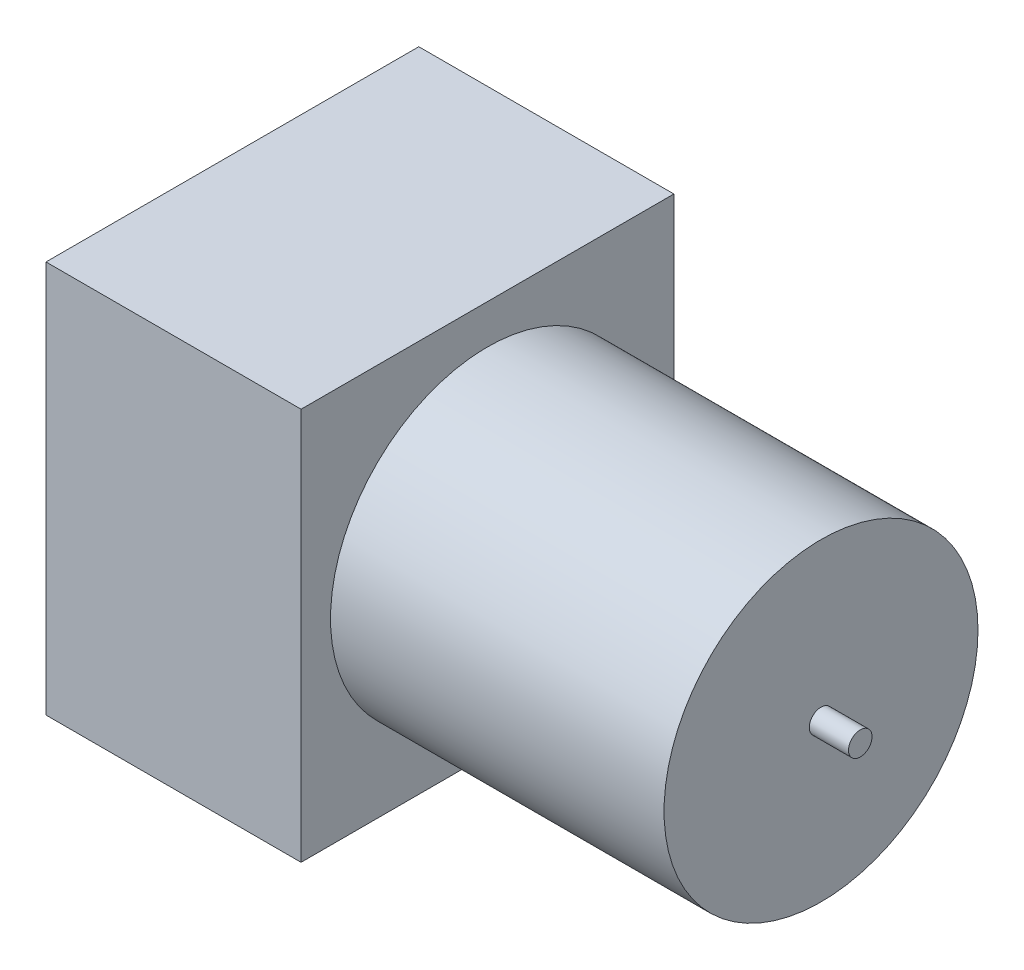
ISO-10303-21;
HEADER;
FILE_DESCRIPTION(('STEP AP214'),'2;1');
FILE_NAME('part.step','',(''),(''),'','','');
FILE_SCHEMA(('AUTOMOTIVE_DESIGN { 1 0 10303 214 1 1 1 1 }'));
ENDSEC;
DATA;
#1=APPLICATION_CONTEXT('core data for automotive mechanical design processes');
#2=APPLICATION_PROTOCOL_DEFINITION('international standard','automotive_design',2000,#1);
#3=PRODUCT_CONTEXT('',#1,'mechanical');
#4=PRODUCT('Part','Part','',(#3));
#5=PRODUCT_RELATED_PRODUCT_CATEGORY('part','',(#4));
#6=PRODUCT_DEFINITION_FORMATION('','',#4);
#7=PRODUCT_DEFINITION_CONTEXT('part definition',#1,'design');
#8=PRODUCT_DEFINITION('design','',#6,#7);
#9=PRODUCT_DEFINITION_SHAPE('','',#8);
#10=(LENGTH_UNIT() NAMED_UNIT(*) SI_UNIT(.MILLI.,.METRE.));
#11=(NAMED_UNIT(*) PLANE_ANGLE_UNIT() SI_UNIT($,.RADIAN.));
#12=(NAMED_UNIT(*) SI_UNIT($,.STERADIAN.) SOLID_ANGLE_UNIT());
#13=UNCERTAINTY_MEASURE_WITH_UNIT(LENGTH_MEASURE(1.E-05),#10,'distance_accuracy_value','');
#14=(GEOMETRIC_REPRESENTATION_CONTEXT(3) GLOBAL_UNCERTAINTY_ASSIGNED_CONTEXT((#13)) GLOBAL_UNIT_ASSIGNED_CONTEXT((#10,
#11,#12)) REPRESENTATION_CONTEXT('',''));
#15=CARTESIAN_POINT('',(0.,0.,0.));
#16=DIRECTION('',(0.,0.,1.));
#17=DIRECTION('',(1.,0.,0.));
#18=AXIS2_PLACEMENT_3D('',#15,#16,#17);
#19=CARTESIAN_POINT('',(65.,100.,47.5));
#20=DIRECTION('',(-1.,0.,0.));
#21=DIRECTION('',(0.,0.,1.));
#22=AXIS2_PLACEMENT_3D('',#19,#20,#21);
#23=PLANE('',#22);
#24=CARTESIAN_POINT('',(65.,50.,0.));
#25=DIRECTION('',(1.,0.,0.));
#26=DIRECTION('',(0.,0.,-1.));
#27=AXIS2_PLACEMENT_3D('',#24,#25,#26);
#28=CIRCLE('',#27,40.);
#29=CARTESIAN_POINT('',(65.,50.,-40.));
#30=VERTEX_POINT('',#29);
#31=EDGE_CURVE('E140',#30,#30,#28,.T.);
#32=ORIENTED_EDGE('',*,*,#31,.F.);
#33=EDGE_LOOP('',(#32));
#34=FACE_BOUND('',#33,.T.);
#35=DIRECTION('',(0.,0.,-1.));
#36=VECTOR('',#35,1.);
#37=CARTESIAN_POINT('',(65.,0.,47.5));
#38=LINE('',#37,#36);
#39=CARTESIAN_POINT('',(65.,0.,47.5));
#40=VERTEX_POINT('',#39);
#41=CARTESIAN_POINT('',(65.,0.,-47.5));
#42=VERTEX_POINT('',#41);
#43=EDGE_CURVE('E125',#40,#42,#38,.T.);
#44=ORIENTED_EDGE('',*,*,#43,.T.);
#45=DIRECTION('',(0.,-1.,0.));
#46=VECTOR('',#45,1.);
#47=CARTESIAN_POINT('',(65.,100.,-47.5));
#48=LINE('',#47,#46);
#49=CARTESIAN_POINT('',(65.,100.,-47.5));
#50=VERTEX_POINT('',#49);
#51=EDGE_CURVE('E112',#50,#42,#48,.T.);
#52=ORIENTED_EDGE('',*,*,#51,.F.);
#53=DIRECTION('',(0.,0.,-1.));
#54=VECTOR('',#53,1.);
#55=CARTESIAN_POINT('',(65.,100.,47.5));
#56=LINE('',#55,#54);
#57=CARTESIAN_POINT('',(65.,100.,47.5));
#58=VERTEX_POINT('',#57);
#59=EDGE_CURVE('E103',#58,#50,#56,.T.);
#60=ORIENTED_EDGE('',*,*,#59,.F.);
#61=DIRECTION('',(0.,-1.,0.));
#62=VECTOR('',#61,1.);
#63=CARTESIAN_POINT('',(65.,100.,47.5));
#64=LINE('',#63,#62);
#65=EDGE_CURVE('E119',#58,#40,#64,.T.);
#66=ORIENTED_EDGE('',*,*,#65,.T.);
#67=EDGE_LOOP('',(#44,#52,#60,#66));
#68=FACE_BOUND('',#67,.T.);
#69=ADVANCED_FACE('F47',(#34,#68),#23,.F.);
#70=CARTESIAN_POINT('',(0.,100.,-47.5));
#71=DIRECTION('',(0.,0.,1.));
#72=DIRECTION('',(1.,0.,0.));
#73=AXIS2_PLACEMENT_3D('',#70,#71,#72);
#74=PLANE('',#73);
#75=DIRECTION('',(-1.,0.,0.));
#76=VECTOR('',#75,1.);
#77=CARTESIAN_POINT('',(0.,0.,-47.5));
#78=LINE('',#77,#76);
#79=CARTESIAN_POINT('',(0.,0.,-47.5));
#80=VERTEX_POINT('',#79);
#81=EDGE_CURVE('E108',#42,#80,#78,.T.);
#82=ORIENTED_EDGE('',*,*,#81,.T.);
#83=DIRECTION('',(0.,-1.,0.));
#84=VECTOR('',#83,1.);
#85=CARTESIAN_POINT('',(0.,100.,-47.5));
#86=LINE('',#85,#84);
#87=CARTESIAN_POINT('',(0.,100.,-47.5));
#88=VERTEX_POINT('',#87);
#89=EDGE_CURVE('E110',#88,#80,#86,.T.);
#90=ORIENTED_EDGE('',*,*,#89,.F.);
#91=DIRECTION('',(-1.,0.,0.));
#92=VECTOR('',#91,1.);
#93=CARTESIAN_POINT('',(0.,100.,-47.5));
#94=LINE('',#93,#92);
#95=EDGE_CURVE('E98',#50,#88,#94,.T.);
#96=ORIENTED_EDGE('',*,*,#95,.F.);
#97=ORIENTED_EDGE('',*,*,#51,.T.);
#98=EDGE_LOOP('',(#82,#90,#96,#97));
#99=FACE_BOUND('',#98,.T.);
#100=ADVANCED_FACE('F107',(#99),#74,.F.);
#101=CARTESIAN_POINT('',(0.,100.,47.5));
#102=DIRECTION('',(1.,0.,0.));
#103=DIRECTION('',(0.,0.,-1.));
#104=AXIS2_PLACEMENT_3D('',#101,#102,#103);
#105=PLANE('',#104);
#106=CARTESIAN_POINT('',(0.,70.,0.));
#107=DIRECTION('',(1.,0.,0.));
#108=DIRECTION('',(0.,0.,-1.));
#109=AXIS2_PLACEMENT_3D('',#106,#107,#108);
#110=CIRCLE('',#109,6.);
#111=CARTESIAN_POINT('',(0.,70.,-6.));
#112=VERTEX_POINT('',#111);
#113=EDGE_CURVE('E55',#112,#112,#110,.F.);
#114=ORIENTED_EDGE('',*,*,#113,.F.);
#115=EDGE_LOOP('',(#114));
#116=FACE_BOUND('',#115,.T.);
#117=CARTESIAN_POINT('',(0.,30.,0.));
#118=DIRECTION('',(1.,0.,0.));
#119=DIRECTION('',(0.,0.,-1.));
#120=AXIS2_PLACEMENT_3D('',#117,#118,#119);
#121=CIRCLE('',#120,6.);
#122=CARTESIAN_POINT('',(0.,30.,-6.));
#123=VERTEX_POINT('',#122);
#124=EDGE_CURVE('E151',#123,#123,#121,.T.);
#125=ORIENTED_EDGE('',*,*,#124,.T.);
#126=EDGE_LOOP('',(#125));
#127=FACE_BOUND('',#126,.T.);
#128=DIRECTION('',(0.,0.,1.));
#129=VECTOR('',#128,1.);
#130=CARTESIAN_POINT('',(0.,0.,47.5));
#131=LINE('',#130,#129);
#132=CARTESIAN_POINT('',(0.,0.,47.5));
#133=VERTEX_POINT('',#132);
#134=EDGE_CURVE('E84',#80,#133,#131,.T.);
#135=ORIENTED_EDGE('',*,*,#134,.T.);
#136=DIRECTION('',(0.,-1.,0.));
#137=VECTOR('',#136,1.);
#138=CARTESIAN_POINT('',(0.,100.,47.5));
#139=LINE('',#138,#137);
#140=CARTESIAN_POINT('',(0.,100.,47.5));
#141=VERTEX_POINT('',#140);
#142=EDGE_CURVE('E115',#141,#133,#139,.T.);
#143=ORIENTED_EDGE('',*,*,#142,.F.);
#144=DIRECTION('',(0.,0.,1.));
#145=VECTOR('',#144,1.);
#146=CARTESIAN_POINT('',(0.,100.,47.5));
#147=LINE('',#146,#145);
#148=EDGE_CURVE('E101',#88,#141,#147,.T.);
#149=ORIENTED_EDGE('',*,*,#148,.F.);
#150=ORIENTED_EDGE('',*,*,#89,.T.);
#151=EDGE_LOOP('',(#135,#143,#149,#150));
#152=FACE_BOUND('',#151,.T.);
#153=ADVANCED_FACE('F111',(#116,#127,#152),#105,.F.);
#154=CARTESIAN_POINT('',(0.,100.,47.5));
#155=DIRECTION('',(0.,0.,-1.));
#156=DIRECTION('',(-1.,0.,0.));
#157=AXIS2_PLACEMENT_3D('',#154,#155,#156);
#158=PLANE('',#157);
#159=DIRECTION('',(1.,0.,0.));
#160=VECTOR('',#159,1.);
#161=CARTESIAN_POINT('',(0.,0.,47.5));
#162=LINE('',#161,#160);
#163=EDGE_CURVE('E89',#133,#40,#162,.T.);
#164=ORIENTED_EDGE('',*,*,#163,.T.);
#165=ORIENTED_EDGE('',*,*,#65,.F.);
#166=DIRECTION('',(1.,0.,0.));
#167=VECTOR('',#166,1.);
#168=CARTESIAN_POINT('',(0.,100.,47.5));
#169=LINE('',#168,#167);
#170=EDGE_CURVE('E70',#141,#58,#169,.T.);
#171=ORIENTED_EDGE('',*,*,#170,.F.);
#172=ORIENTED_EDGE('',*,*,#142,.T.);
#173=EDGE_LOOP('',(#164,#165,#171,#172));
#174=FACE_BOUND('',#173,.T.);
#175=ADVANCED_FACE('F220',(#174),#158,.F.);
#176=CARTESIAN_POINT('',(0.,100.,0.));
#177=DIRECTION('',(0.,-1.,0.));
#178=DIRECTION('',(0.,0.,-1.));
#179=AXIS2_PLACEMENT_3D('',#176,#177,#178);
#180=PLANE('',#179);
#181=ORIENTED_EDGE('',*,*,#59,.T.);
#182=ORIENTED_EDGE('',*,*,#95,.T.);
#183=ORIENTED_EDGE('',*,*,#148,.T.);
#184=ORIENTED_EDGE('',*,*,#170,.T.);
#185=EDGE_LOOP('',(#181,#182,#183,#184));
#186=FACE_BOUND('',#185,.T.);
#187=ADVANCED_FACE('F97',(#186),#180,.F.);
#188=CARTESIAN_POINT('',(0.,0.,0.));
#189=DIRECTION('',(0.,-1.,0.));
#190=DIRECTION('',(0.,0.,-1.));
#191=AXIS2_PLACEMENT_3D('',#188,#189,#190);
#192=PLANE('',#191);
#193=ORIENTED_EDGE('',*,*,#43,.F.);
#194=ORIENTED_EDGE('',*,*,#163,.F.);
#195=ORIENTED_EDGE('',*,*,#134,.F.);
#196=ORIENTED_EDGE('',*,*,#81,.F.);
#197=EDGE_LOOP('',(#193,#194,#195,#196));
#198=FACE_BOUND('',#197,.T.);
#199=ADVANCED_FACE('F203',(#198),#192,.T.);
#200=CARTESIAN_POINT('',(150.,50.,0.));
#201=DIRECTION('',(-1.,0.,0.));
#202=DIRECTION('',(0.,0.,1.));
#203=AXIS2_PLACEMENT_3D('',#200,#201,#202);
#204=CYLINDRICAL_SURFACE('',#203,40.);
#205=CARTESIAN_POINT('',(150.,50.,0.));
#206=DIRECTION('',(1.,0.,0.));
#207=DIRECTION('',(0.,0.,-1.));
#208=AXIS2_PLACEMENT_3D('',#205,#206,#207);
#209=CIRCLE('',#208,40.);
#210=CARTESIAN_POINT('',(150.,50.,-40.));
#211=VERTEX_POINT('',#210);
#212=EDGE_CURVE('E127',#211,#211,#209,.T.);
#213=ORIENTED_EDGE('',*,*,#212,.F.);
#214=EDGE_LOOP('',(#213));
#215=FACE_BOUND('',#214,.T.);
#216=ORIENTED_EDGE('',*,*,#31,.T.);
#217=EDGE_LOOP('',(#216));
#218=FACE_BOUND('',#217,.T.);
#219=ADVANCED_FACE('F198',(#215,#218),#204,.T.);
#220=CARTESIAN_POINT('',(150.,50.,0.));
#221=DIRECTION('',(1.,0.,0.));
#222=DIRECTION('',(0.,0.,-1.));
#223=AXIS2_PLACEMENT_3D('',#220,#221,#222);
#224=PLANE('',#223);
#225=CARTESIAN_POINT('',(150.,50.,0.));
#226=DIRECTION('',(1.,0.,0.));
#227=DIRECTION('',(0.,0.,-1.));
#228=AXIS2_PLACEMENT_3D('',#225,#226,#227);
#229=CIRCLE('',#228,3.);
#230=CARTESIAN_POINT('',(150.,50.,-3.));
#231=VERTEX_POINT('',#230);
#232=EDGE_CURVE('E11',#231,#231,#229,.T.);
#233=ORIENTED_EDGE('',*,*,#232,.F.);
#234=EDGE_LOOP('',(#233));
#235=FACE_BOUND('',#234,.T.);
#236=ORIENTED_EDGE('',*,*,#212,.T.);
#237=EDGE_LOOP('',(#236));
#238=FACE_BOUND('',#237,.T.);
#239=ADVANCED_FACE('F195',(#235,#238),#224,.T.);
#240=CARTESIAN_POINT('',(0.,30.,0.));
#241=DIRECTION('',(-1.,0.,0.));
#242=DIRECTION('',(0.,0.,1.));
#243=AXIS2_PLACEMENT_3D('',#240,#241,#242);
#244=CYLINDRICAL_SURFACE('',#243,6.);
#245=ORIENTED_EDGE('',*,*,#124,.F.);
#246=EDGE_LOOP('',(#245));
#247=FACE_BOUND('',#246,.T.);
#248=CARTESIAN_POINT('',(-12.,30.,0.));
#249=DIRECTION('',(1.,0.,0.));
#250=DIRECTION('',(0.,0.,-1.));
#251=AXIS2_PLACEMENT_3D('',#248,#249,#250);
#252=CIRCLE('',#251,6.);
#253=CARTESIAN_POINT('',(-12.,30.,-6.));
#254=VERTEX_POINT('',#253);
#255=EDGE_CURVE('E152',#254,#254,#252,.T.);
#256=ORIENTED_EDGE('',*,*,#255,.T.);
#257=EDGE_LOOP('',(#256));
#258=FACE_BOUND('',#257,.T.);
#259=ADVANCED_FACE('F191',(#247,#258),#244,.T.);
#260=CARTESIAN_POINT('',(-12.,30.,0.));
#261=DIRECTION('',(1.,0.,0.));
#262=DIRECTION('',(0.,0.,-1.));
#263=AXIS2_PLACEMENT_3D('',#260,#261,#262);
#264=PLANE('',#263);
#265=CARTESIAN_POINT('',(-12.,30.,0.));
#266=DIRECTION('',(1.,0.,0.));
#267=DIRECTION('',(0.,0.,-1.));
#268=AXIS2_PLACEMENT_3D('',#265,#266,#267);
#269=CIRCLE('',#268,3.2);
#270=CARTESIAN_POINT('',(-12.,30.,-3.2));
#271=VERTEX_POINT('',#270);
#272=EDGE_CURVE('E161',#271,#271,#269,.T.);
#273=ORIENTED_EDGE('',*,*,#272,.T.);
#274=EDGE_LOOP('',(#273));
#275=FACE_BOUND('',#274,.T.);
#276=ORIENTED_EDGE('',*,*,#255,.F.);
#277=EDGE_LOOP('',(#276));
#278=FACE_BOUND('',#277,.T.);
#279=ADVANCED_FACE('F231',(#275,#278),#264,.F.);
#280=CARTESIAN_POINT('',(-2.,30.,0.));
#281=DIRECTION('',(-1.,0.,0.));
#282=DIRECTION('',(0.,0.,1.));
#283=AXIS2_PLACEMENT_3D('',#280,#281,#282);
#284=CYLINDRICAL_SURFACE('',#283,3.2);
#285=CARTESIAN_POINT('',(-2.,30.,0.));
#286=DIRECTION('',(1.,0.,0.));
#287=DIRECTION('',(0.,0.,-1.));
#288=AXIS2_PLACEMENT_3D('',#285,#286,#287);
#289=CIRCLE('',#288,3.2);
#290=CARTESIAN_POINT('',(-2.,30.,-3.2));
#291=VERTEX_POINT('',#290);
#292=EDGE_CURVE('E158',#291,#291,#289,.T.);
#293=ORIENTED_EDGE('',*,*,#292,.T.);
#294=EDGE_LOOP('',(#293));
#295=FACE_BOUND('',#294,.T.);
#296=ORIENTED_EDGE('',*,*,#272,.F.);
#297=EDGE_LOOP('',(#296));
#298=FACE_BOUND('',#297,.T.);
#299=ADVANCED_FACE('F238',(#295,#298),#284,.F.);
#300=CARTESIAN_POINT('',(-2.,30.,0.));
#301=DIRECTION('',(1.,0.,0.));
#302=DIRECTION('',(0.,0.,-1.));
#303=AXIS2_PLACEMENT_3D('',#300,#301,#302);
#304=PLANE('',#303);
#305=ORIENTED_EDGE('',*,*,#292,.F.);
#306=EDGE_LOOP('',(#305));
#307=FACE_BOUND('',#306,.T.);
#308=ADVANCED_FACE('F247',(#307),#304,.F.);
#309=CARTESIAN_POINT('',(0.,70.,0.));
#310=DIRECTION('',(-1.,0.,0.));
#311=DIRECTION('',(0.,0.,1.));
#312=AXIS2_PLACEMENT_3D('',#309,#310,#311);
#313=CYLINDRICAL_SURFACE('',#312,6.);
#314=ORIENTED_EDGE('',*,*,#113,.T.);
#315=EDGE_LOOP('',(#314));
#316=FACE_BOUND('',#315,.T.);
#317=CARTESIAN_POINT('',(-12.,70.,0.));
#318=DIRECTION('',(1.,0.,0.));
#319=DIRECTION('',(0.,0.,-1.));
#320=AXIS2_PLACEMENT_3D('',#317,#318,#319);
#321=CIRCLE('',#320,6.);
#322=CARTESIAN_POINT('',(-12.,70.,-6.));
#323=VERTEX_POINT('',#322);
#324=EDGE_CURVE('E164',#323,#323,#321,.T.);
#325=ORIENTED_EDGE('',*,*,#324,.T.);
#326=EDGE_LOOP('',(#325));
#327=FACE_BOUND('',#326,.T.);
#328=ADVANCED_FACE('F253',(#316,#327),#313,.T.);
#329=CARTESIAN_POINT('',(-12.,70.,0.));
#330=DIRECTION('',(1.,0.,0.));
#331=DIRECTION('',(0.,0.,-1.));
#332=AXIS2_PLACEMENT_3D('',#329,#330,#331);
#333=PLANE('',#332);
#334=CARTESIAN_POINT('',(-12.,70.,0.));
#335=DIRECTION('',(1.,0.,0.));
#336=DIRECTION('',(0.,0.,-1.));
#337=AXIS2_PLACEMENT_3D('',#334,#335,#336);
#338=CIRCLE('',#337,3.2);
#339=CARTESIAN_POINT('',(-12.,70.,-3.2));
#340=VERTEX_POINT('',#339);
#341=EDGE_CURVE('E174',#340,#340,#338,.T.);
#342=ORIENTED_EDGE('',*,*,#341,.T.);
#343=EDGE_LOOP('',(#342));
#344=FACE_BOUND('',#343,.T.);
#345=ORIENTED_EDGE('',*,*,#324,.F.);
#346=EDGE_LOOP('',(#345));
#347=FACE_BOUND('',#346,.T.);
#348=ADVANCED_FACE('F255',(#344,#347),#333,.F.);
#349=CARTESIAN_POINT('',(-2.,70.,0.));
#350=DIRECTION('',(-1.,0.,0.));
#351=DIRECTION('',(0.,0.,1.));
#352=AXIS2_PLACEMENT_3D('',#349,#350,#351);
#353=CYLINDRICAL_SURFACE('',#352,3.2);
#354=CARTESIAN_POINT('',(-2.,70.,0.));
#355=DIRECTION('',(1.,0.,0.));
#356=DIRECTION('',(0.,0.,-1.));
#357=AXIS2_PLACEMENT_3D('',#354,#355,#356);
#358=CIRCLE('',#357,3.2);
#359=CARTESIAN_POINT('',(-2.,70.,-3.2));
#360=VERTEX_POINT('',#359);
#361=EDGE_CURVE('E166',#360,#360,#358,.T.);
#362=ORIENTED_EDGE('',*,*,#361,.T.);
#363=EDGE_LOOP('',(#362));
#364=FACE_BOUND('',#363,.T.);
#365=ORIENTED_EDGE('',*,*,#341,.F.);
#366=EDGE_LOOP('',(#365));
#367=FACE_BOUND('',#366,.T.);
#368=ADVANCED_FACE('F256',(#364,#367),#353,.F.);
#369=CARTESIAN_POINT('',(-2.,70.,0.));
#370=DIRECTION('',(1.,0.,0.));
#371=DIRECTION('',(0.,0.,-1.));
#372=AXIS2_PLACEMENT_3D('',#369,#370,#371);
#373=PLANE('',#372);
#374=ORIENTED_EDGE('',*,*,#361,.F.);
#375=EDGE_LOOP('',(#374));
#376=FACE_BOUND('',#375,.T.);
#377=ADVANCED_FACE('F189',(#376),#373,.F.);
#378=CARTESIAN_POINT('',(160.,50.,0.));
#379=DIRECTION('',(-1.,0.,0.));
#380=DIRECTION('',(0.,0.,1.));
#381=AXIS2_PLACEMENT_3D('',#378,#379,#380);
#382=CYLINDRICAL_SURFACE('',#381,3.);
#383=CARTESIAN_POINT('',(160.,50.,0.));
#384=DIRECTION('',(1.,0.,0.));
#385=DIRECTION('',(0.,0.,-1.));
#386=AXIS2_PLACEMENT_3D('',#383,#384,#385);
#387=CIRCLE('',#386,3.);
#388=CARTESIAN_POINT('',(160.,50.,-3.));
#389=VERTEX_POINT('',#388);
#390=EDGE_CURVE('E180',#389,#389,#387,.T.);
#391=ORIENTED_EDGE('',*,*,#390,.F.);
#392=EDGE_LOOP('',(#391));
#393=FACE_BOUND('',#392,.T.);
#394=ORIENTED_EDGE('',*,*,#232,.T.);
#395=EDGE_LOOP('',(#394));
#396=FACE_BOUND('',#395,.T.);
#397=ADVANCED_FACE('F183',(#393,#396),#382,.T.);
#398=CARTESIAN_POINT('',(160.,50.,0.));
#399=DIRECTION('',(1.,0.,0.));
#400=DIRECTION('',(0.,0.,-1.));
#401=AXIS2_PLACEMENT_3D('',#398,#399,#400);
#402=PLANE('',#401);
#403=ORIENTED_EDGE('',*,*,#390,.T.);
#404=EDGE_LOOP('',(#403));
#405=FACE_BOUND('',#404,.T.);
#406=ADVANCED_FACE('F181',(#405),#402,.T.);
#407=CLOSED_SHELL('',(#69,#100,#153,#175,#187,#199,#219,#239,#259,#279,#299,#308,#328,#348,#368,
#377,#397,#406));
#408=MANIFOLD_SOLID_BREP('B2',#407);
#409=ADVANCED_BREP_SHAPE_REPRESENTATION('',(#18,#408),#14);
#410=SHAPE_DEFINITION_REPRESENTATION(#9,#409);
ENDSEC;
END-ISO-10303-21;
